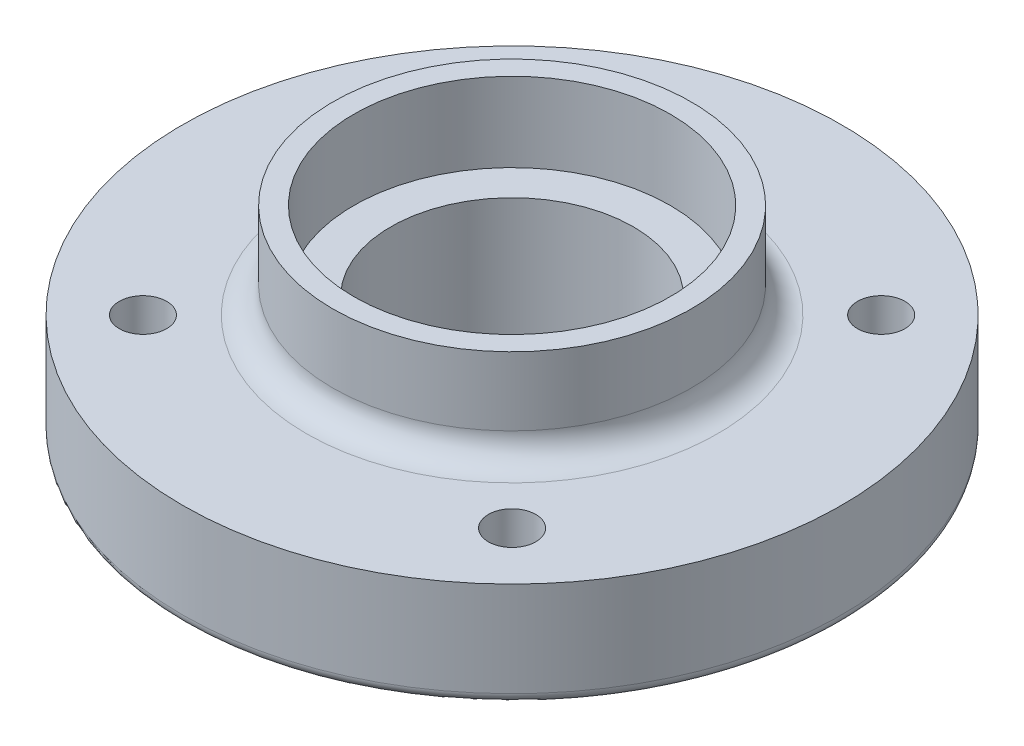
ISO-10303-21;
HEADER;
FILE_DESCRIPTION(('STEP AP214'),'2;1');
FILE_NAME('part.step','',(''),(''),'','','');
FILE_SCHEMA(('AUTOMOTIVE_DESIGN { 1 0 10303 214 1 1 1 1 }'));
ENDSEC;
DATA;
#1=APPLICATION_CONTEXT('core data for automotive mechanical design processes');
#2=APPLICATION_PROTOCOL_DEFINITION('international standard','automotive_design',2000,#1);
#3=PRODUCT_CONTEXT('',#1,'mechanical');
#4=PRODUCT('Part','Part','',(#3));
#5=PRODUCT_RELATED_PRODUCT_CATEGORY('part','',(#4));
#6=PRODUCT_DEFINITION_FORMATION('','',#4);
#7=PRODUCT_DEFINITION_CONTEXT('part definition',#1,'design');
#8=PRODUCT_DEFINITION('design','',#6,#7);
#9=PRODUCT_DEFINITION_SHAPE('','',#8);
#10=(LENGTH_UNIT() NAMED_UNIT(*) SI_UNIT(.MILLI.,.METRE.));
#11=(NAMED_UNIT(*) PLANE_ANGLE_UNIT() SI_UNIT($,.RADIAN.));
#12=(NAMED_UNIT(*) SI_UNIT($,.STERADIAN.) SOLID_ANGLE_UNIT());
#13=UNCERTAINTY_MEASURE_WITH_UNIT(LENGTH_MEASURE(1.E-05),#10,'distance_accuracy_value','');
#14=(GEOMETRIC_REPRESENTATION_CONTEXT(3) GLOBAL_UNCERTAINTY_ASSIGNED_CONTEXT((#13)) GLOBAL_UNIT_ASSIGNED_CONTEXT((#10,
#11,#12)) REPRESENTATION_CONTEXT('',''));
#15=CARTESIAN_POINT('',(0.,0.,0.));
#16=DIRECTION('',(0.,0.,1.));
#17=DIRECTION('',(1.,0.,0.));
#18=AXIS2_PLACEMENT_3D('',#15,#16,#17);
#19=CARTESIAN_POINT('',(0.,0.,0.));
#20=DIRECTION('',(0.,1.,0.));
#21=DIRECTION('',(0.,0.,1.));
#22=AXIS2_PLACEMENT_3D('',#19,#20,#21);
#23=PLANE('',#22);
#24=CARTESIAN_POINT('',(0.,0.,0.));
#25=DIRECTION('',(0.,1.,0.));
#26=DIRECTION('',(0.,0.,1.));
#27=AXIS2_PLACEMENT_3D('',#24,#25,#26);
#28=CIRCLE('',#27,36.);
#29=CARTESIAN_POINT('',(0.,0.,36.));
#30=VERTEX_POINT('',#29);
#31=EDGE_CURVE('E11',#30,#30,#28,.T.);
#32=ORIENTED_EDGE('',*,*,#31,.T.);
#33=EDGE_LOOP('',(#32));
#34=FACE_BOUND('',#33,.T.);
#35=CARTESIAN_POINT('',(-35.,0.,-35.));
#36=DIRECTION('',(0.,-1.,0.));
#37=DIRECTION('',(0.,0.,-1.));
#38=AXIS2_PLACEMENT_3D('',#35,#36,#37);
#39=CIRCLE('',#38,9.0055);
#40=CARTESIAN_POINT('',(-35.,0.,-44.0055));
#41=VERTEX_POINT('',#40);
#42=EDGE_CURVE('E79',#41,#41,#39,.T.);
#43=ORIENTED_EDGE('',*,*,#42,.F.);
#44=EDGE_LOOP('',(#43));
#45=FACE_BOUND('',#44,.T.);
#46=CARTESIAN_POINT('',(35.,0.,-35.));
#47=DIRECTION('',(0.,-1.,0.));
#48=DIRECTION('',(0.,0.,-1.));
#49=AXIS2_PLACEMENT_3D('',#46,#47,#48);
#50=CIRCLE('',#49,9.0055);
#51=CARTESIAN_POINT('',(35.,0.,-44.0055));
#52=VERTEX_POINT('',#51);
#53=EDGE_CURVE('E74',#52,#52,#50,.T.);
#54=ORIENTED_EDGE('',*,*,#53,.F.);
#55=EDGE_LOOP('',(#54));
#56=FACE_BOUND('',#55,.T.);
#57=CARTESIAN_POINT('',(35.,0.,35.));
#58=DIRECTION('',(0.,-1.,0.));
#59=DIRECTION('',(0.,0.,-1.));
#60=AXIS2_PLACEMENT_3D('',#57,#58,#59);
#61=CIRCLE('',#60,9.0055);
#62=CARTESIAN_POINT('',(35.,0.,25.9945));
#63=VERTEX_POINT('',#62);
#64=EDGE_CURVE('E69',#63,#63,#61,.T.);
#65=ORIENTED_EDGE('',*,*,#64,.F.);
#66=EDGE_LOOP('',(#65));
#67=FACE_BOUND('',#66,.T.);
#68=CARTESIAN_POINT('',(-35.,0.,35.));
#69=DIRECTION('',(0.,-1.,0.));
#70=DIRECTION('',(0.,0.,-1.));
#71=AXIS2_PLACEMENT_3D('',#68,#69,#70);
#72=CIRCLE('',#71,9.0055);
#73=CARTESIAN_POINT('',(-35.,0.,25.9945));
#74=VERTEX_POINT('',#73);
#75=EDGE_CURVE('E128',#74,#74,#72,.T.);
#76=ORIENTED_EDGE('',*,*,#75,.F.);
#77=EDGE_LOOP('',(#76));
#78=FACE_BOUND('',#77,.T.);
#79=CARTESIAN_POINT('',(0.,0.,0.));
#80=DIRECTION('',(0.,1.,0.));
#81=DIRECTION('',(0.,0.,1.));
#82=AXIS2_PLACEMENT_3D('',#79,#80,#81);
#83=CIRCLE('',#82,60.5);
#84=CARTESIAN_POINT('',(0.,0.,60.5));
#85=VERTEX_POINT('',#84);
#86=EDGE_CURVE('E59',#85,#85,#83,.F.);
#87=ORIENTED_EDGE('',*,*,#86,.T.);
#88=EDGE_LOOP('',(#87));
#89=FACE_BOUND('',#88,.T.);
#90=ADVANCED_FACE('F39',(#34,#45,#56,#67,#78,#89),#23,.F.);
#91=CARTESIAN_POINT('',(0.,20.,0.));
#92=DIRECTION('',(0.,-1.,0.));
#93=DIRECTION('',(0.,0.,-1.));
#94=AXIS2_PLACEMENT_3D('',#91,#92,#93);
#95=CYLINDRICAL_SURFACE('',#94,62.5);
#96=CARTESIAN_POINT('',(0.,2.,0.));
#97=DIRECTION('',(0.,1.,0.));
#98=DIRECTION('',(0.,0.,1.));
#99=AXIS2_PLACEMENT_3D('',#96,#97,#98);
#100=CIRCLE('',#99,62.5);
#101=CARTESIAN_POINT('',(0.,2.,62.5));
#102=VERTEX_POINT('',#101);
#103=EDGE_CURVE('E62',#102,#102,#100,.T.);
#104=ORIENTED_EDGE('',*,*,#103,.T.);
#105=EDGE_LOOP('',(#104));
#106=FACE_BOUND('',#105,.T.);
#107=CARTESIAN_POINT('',(0.,20.,0.));
#108=DIRECTION('',(0.,1.,0.));
#109=DIRECTION('',(0.,0.,1.));
#110=AXIS2_PLACEMENT_3D('',#107,#108,#109);
#111=CIRCLE('',#110,62.5);
#112=CARTESIAN_POINT('',(0.,20.,62.5));
#113=VERTEX_POINT('',#112);
#114=EDGE_CURVE('E91',#113,#113,#111,.T.);
#115=ORIENTED_EDGE('',*,*,#114,.F.);
#116=EDGE_LOOP('',(#115));
#117=FACE_BOUND('',#116,.T.);
#118=ADVANCED_FACE('F155',(#106,#117),#95,.T.);
#119=CARTESIAN_POINT('',(0.,20.,0.));
#120=DIRECTION('',(0.,1.,0.));
#121=DIRECTION('',(0.,0.,1.));
#122=AXIS2_PLACEMENT_3D('',#119,#120,#121);
#123=PLANE('',#122);
#124=CARTESIAN_POINT('',(-35.,20.,35.));
#125=DIRECTION('',(0.,1.,0.));
#126=DIRECTION('',(0.,0.,1.));
#127=AXIS2_PLACEMENT_3D('',#124,#125,#126);
#128=CIRCLE('',#127,4.5);
#129=CARTESIAN_POINT('',(-35.,20.,39.5));
#130=VERTEX_POINT('',#129);
#131=EDGE_CURVE('E66',#130,#130,#128,.T.);
#132=ORIENTED_EDGE('',*,*,#131,.F.);
#133=EDGE_LOOP('',(#132));
#134=FACE_BOUND('',#133,.T.);
#135=CARTESIAN_POINT('',(35.,20.,35.));
#136=DIRECTION('',(0.,1.,0.));
#137=DIRECTION('',(0.,0.,1.));
#138=AXIS2_PLACEMENT_3D('',#135,#136,#137);
#139=CIRCLE('',#138,4.5);
#140=CARTESIAN_POINT('',(35.,20.,39.5));
#141=VERTEX_POINT('',#140);
#142=EDGE_CURVE('E71',#141,#141,#139,.T.);
#143=ORIENTED_EDGE('',*,*,#142,.F.);
#144=EDGE_LOOP('',(#143));
#145=FACE_BOUND('',#144,.T.);
#146=CARTESIAN_POINT('',(35.,20.,-35.));
#147=DIRECTION('',(0.,1.,0.));
#148=DIRECTION('',(0.,0.,1.));
#149=AXIS2_PLACEMENT_3D('',#146,#147,#148);
#150=CIRCLE('',#149,4.5);
#151=CARTESIAN_POINT('',(35.,20.,-30.5));
#152=VERTEX_POINT('',#151);
#153=EDGE_CURVE('E76',#152,#152,#150,.T.);
#154=ORIENTED_EDGE('',*,*,#153,.F.);
#155=EDGE_LOOP('',(#154));
#156=FACE_BOUND('',#155,.T.);
#157=CARTESIAN_POINT('',(-35.,20.,-35.));
#158=DIRECTION('',(0.,1.,0.));
#159=DIRECTION('',(0.,0.,1.));
#160=AXIS2_PLACEMENT_3D('',#157,#158,#159);
#161=CIRCLE('',#160,4.5);
#162=CARTESIAN_POINT('',(-35.,20.,-30.5));
#163=VERTEX_POINT('',#162);
#164=EDGE_CURVE('E81',#163,#163,#161,.T.);
#165=ORIENTED_EDGE('',*,*,#164,.F.);
#166=EDGE_LOOP('',(#165));
#167=FACE_BOUND('',#166,.T.);
#168=CARTESIAN_POINT('',(0.,20.,0.));
#169=DIRECTION('',(0.,1.,0.));
#170=DIRECTION('',(0.,0.,1.));
#171=AXIS2_PLACEMENT_3D('',#168,#169,#170);
#172=CIRCLE('',#171,39.);
#173=CARTESIAN_POINT('',(0.,20.,39.));
#174=VERTEX_POINT('',#173);
#175=EDGE_CURVE('E65',#174,#174,#172,.F.);
#176=ORIENTED_EDGE('',*,*,#175,.T.);
#177=EDGE_LOOP('',(#176));
#178=FACE_BOUND('',#177,.T.);
#179=ORIENTED_EDGE('',*,*,#114,.T.);
#180=EDGE_LOOP('',(#179));
#181=FACE_BOUND('',#180,.T.);
#182=ADVANCED_FACE('F160',(#134,#145,#156,#167,#178,#181),#123,.T.);
#183=CARTESIAN_POINT('',(0.,38.,0.));
#184=DIRECTION('',(0.,-1.,0.));
#185=DIRECTION('',(0.,0.,-1.));
#186=AXIS2_PLACEMENT_3D('',#183,#184,#185);
#187=CYLINDRICAL_SURFACE('',#186,34.);
#188=CARTESIAN_POINT('',(0.,25.,0.));
#189=DIRECTION('',(0.,1.,0.));
#190=DIRECTION('',(0.,0.,1.));
#191=AXIS2_PLACEMENT_3D('',#188,#189,#190);
#192=CIRCLE('',#191,34.);
#193=CARTESIAN_POINT('',(0.,25.,34.));
#194=VERTEX_POINT('',#193);
#195=EDGE_CURVE('E88',#194,#194,#192,.T.);
#196=ORIENTED_EDGE('',*,*,#195,.T.);
#197=EDGE_LOOP('',(#196));
#198=FACE_BOUND('',#197,.T.);
#199=CARTESIAN_POINT('',(0.,38.,0.));
#200=DIRECTION('',(0.,1.,0.));
#201=DIRECTION('',(0.,0.,1.));
#202=AXIS2_PLACEMENT_3D('',#199,#200,#201);
#203=CIRCLE('',#202,34.);
#204=CARTESIAN_POINT('',(0.,38.,34.));
#205=VERTEX_POINT('',#204);
#206=EDGE_CURVE('E94',#205,#205,#203,.T.);
#207=ORIENTED_EDGE('',*,*,#206,.F.);
#208=EDGE_LOOP('',(#207));
#209=FACE_BOUND('',#208,.T.);
#210=ADVANCED_FACE('F366',(#198,#209),#187,.T.);
#211=CARTESIAN_POINT('',(0.,38.,0.));
#212=DIRECTION('',(0.,1.,0.));
#213=DIRECTION('',(0.,0.,1.));
#214=AXIS2_PLACEMENT_3D('',#211,#212,#213);
#215=PLANE('',#214);
#216=CARTESIAN_POINT('',(0.,38.,0.));
#217=DIRECTION('',(0.,1.,0.));
#218=DIRECTION('',(0.,0.,1.));
#219=AXIS2_PLACEMENT_3D('',#216,#217,#218);
#220=CIRCLE('',#219,30.);
#221=CARTESIAN_POINT('',(0.,38.,30.));
#222=VERTEX_POINT('',#221);
#223=EDGE_CURVE('E84',#222,#222,#220,.T.);
#224=ORIENTED_EDGE('',*,*,#223,.F.);
#225=EDGE_LOOP('',(#224));
#226=FACE_BOUND('',#225,.T.);
#227=ORIENTED_EDGE('',*,*,#206,.T.);
#228=EDGE_LOOP('',(#227));
#229=FACE_BOUND('',#228,.T.);
#230=ADVANCED_FACE('F380',(#226,#229),#215,.T.);
#231=CARTESIAN_POINT('',(0.,23.,0.));
#232=DIRECTION('',(0.,1.,0.));
#233=DIRECTION('',(0.,0.,1.));
#234=AXIS2_PLACEMENT_3D('',#231,#232,#233);
#235=CYLINDRICAL_SURFACE('',#234,30.);
#236=CARTESIAN_POINT('',(0.,23.,0.));
#237=DIRECTION('',(0.,1.,0.));
#238=DIRECTION('',(0.,0.,1.));
#239=AXIS2_PLACEMENT_3D('',#236,#237,#238);
#240=CIRCLE('',#239,30.);
#241=CARTESIAN_POINT('',(0.,23.,30.));
#242=VERTEX_POINT('',#241);
#243=EDGE_CURVE('E97',#242,#242,#240,.T.);
#244=ORIENTED_EDGE('',*,*,#243,.F.);
#245=EDGE_LOOP('',(#244));
#246=FACE_BOUND('',#245,.T.);
#247=ORIENTED_EDGE('',*,*,#223,.T.);
#248=EDGE_LOOP('',(#247));
#249=FACE_BOUND('',#248,.T.);
#250=ADVANCED_FACE('F223',(#246,#249),#235,.F.);
#251=CARTESIAN_POINT('',(0.,23.,0.));
#252=DIRECTION('',(0.,1.,0.));
#253=DIRECTION('',(0.,0.,1.));
#254=AXIS2_PLACEMENT_3D('',#251,#252,#253);
#255=PLANE('',#254);
#256=CARTESIAN_POINT('',(0.,23.,0.));
#257=DIRECTION('',(0.,1.,0.));
#258=DIRECTION('',(0.,0.,1.));
#259=AXIS2_PLACEMENT_3D('',#256,#257,#258);
#260=CIRCLE('',#259,23.);
#261=CARTESIAN_POINT('',(0.,23.,23.));
#262=VERTEX_POINT('',#261);
#263=EDGE_CURVE('E131',#262,#262,#260,.T.);
#264=ORIENTED_EDGE('',*,*,#263,.F.);
#265=EDGE_LOOP('',(#264));
#266=FACE_BOUND('',#265,.T.);
#267=ORIENTED_EDGE('',*,*,#243,.T.);
#268=EDGE_LOOP('',(#267));
#269=FACE_BOUND('',#268,.T.);
#270=ADVANCED_FACE('F171',(#266,#269),#255,.T.);
#271=CARTESIAN_POINT('',(0.,25.,0.));
#272=DIRECTION('',(0.,1.,0.));
#273=DIRECTION('',(0.,0.,1.));
#274=AXIS2_PLACEMENT_3D('',#271,#272,#273);
#275=TOROIDAL_SURFACE('',#274,39.,5.);
#276=ORIENTED_EDGE('',*,*,#175,.F.);
#277=EDGE_LOOP('',(#276));
#278=FACE_BOUND('',#277,.T.);
#279=ORIENTED_EDGE('',*,*,#195,.F.);
#280=EDGE_LOOP('',(#279));
#281=FACE_BOUND('',#280,.T.);
#282=ADVANCED_FACE('F167',(#278,#281),#275,.F.);
#283=CARTESIAN_POINT('',(-35.,0.,-35.));
#284=DIRECTION('',(0.,-1.,0.));
#285=DIRECTION('',(0.,0.,-1.));
#286=AXIS2_PLACEMENT_3D('',#283,#284,#285);
#287=CYLINDRICAL_SURFACE('',#286,4.5);
#288=ORIENTED_EDGE('',*,*,#164,.T.);
#289=EDGE_LOOP('',(#288));
#290=FACE_BOUND('',#289,.T.);
#291=CARTESIAN_POINT('',(-35.,5.3,-35.));
#292=DIRECTION('',(0.,-1.,0.));
#293=DIRECTION('',(0.,0.,-1.));
#294=AXIS2_PLACEMENT_3D('',#291,#292,#293);
#295=CIRCLE('',#294,4.50000000000001);
#296=CARTESIAN_POINT('',(-35.,5.3,-39.5));
#297=VERTEX_POINT('',#296);
#298=EDGE_CURVE('E85',#297,#297,#295,.T.);
#299=ORIENTED_EDGE('',*,*,#298,.T.);
#300=EDGE_LOOP('',(#299));
#301=FACE_BOUND('',#300,.T.);
#302=ADVANCED_FACE('F170',(#290,#301),#287,.F.);
#303=CARTESIAN_POINT('',(-30.5,5.3,-35.));
#304=DIRECTION('',(0.,1.,0.));
#305=DIRECTION('',(0.,0.,1.));
#306=AXIS2_PLACEMENT_3D('',#303,#304,#305);
#307=PLANE('',#306);
#308=ORIENTED_EDGE('',*,*,#298,.F.);
#309=EDGE_LOOP('',(#308));
#310=FACE_BOUND('',#309,.T.);
#311=CARTESIAN_POINT('',(-35.,5.3,-35.));
#312=DIRECTION('',(0.,-1.,0.));
#313=DIRECTION('',(0.,0.,-1.));
#314=AXIS2_PLACEMENT_3D('',#311,#312,#313);
#315=CIRCLE('',#314,9.0055);
#316=CARTESIAN_POINT('',(-35.,5.3,-44.0055));
#317=VERTEX_POINT('',#316);
#318=EDGE_CURVE('E104',#317,#317,#315,.T.);
#319=ORIENTED_EDGE('',*,*,#318,.T.);
#320=EDGE_LOOP('',(#319));
#321=FACE_BOUND('',#320,.T.);
#322=ADVANCED_FACE('F340',(#310,#321),#307,.F.);
#323=CARTESIAN_POINT('',(-35.,0.,-35.));
#324=DIRECTION('',(0.,-1.,0.));
#325=DIRECTION('',(0.,0.,-1.));
#326=AXIS2_PLACEMENT_3D('',#323,#324,#325);
#327=CYLINDRICAL_SURFACE('',#326,9.0055);
#328=ORIENTED_EDGE('',*,*,#318,.F.);
#329=EDGE_LOOP('',(#328));
#330=FACE_BOUND('',#329,.T.);
#331=ORIENTED_EDGE('',*,*,#42,.T.);
#332=EDGE_LOOP('',(#331));
#333=FACE_BOUND('',#332,.T.);
#334=ADVANCED_FACE('F330',(#330,#333),#327,.F.);
#335=CARTESIAN_POINT('',(35.,0.,-35.));
#336=DIRECTION('',(0.,-1.,0.));
#337=DIRECTION('',(0.,0.,-1.));
#338=AXIS2_PLACEMENT_3D('',#335,#336,#337);
#339=CYLINDRICAL_SURFACE('',#338,4.5);
#340=ORIENTED_EDGE('',*,*,#153,.T.);
#341=EDGE_LOOP('',(#340));
#342=FACE_BOUND('',#341,.T.);
#343=CARTESIAN_POINT('',(35.,5.3,-35.));
#344=DIRECTION('',(0.,-1.,0.));
#345=DIRECTION('',(0.,0.,-1.));
#346=AXIS2_PLACEMENT_3D('',#343,#344,#345);
#347=CIRCLE('',#346,4.50000000000001);
#348=CARTESIAN_POINT('',(35.,5.3,-39.5));
#349=VERTEX_POINT('',#348);
#350=EDGE_CURVE('E80',#349,#349,#347,.T.);
#351=ORIENTED_EDGE('',*,*,#350,.T.);
#352=EDGE_LOOP('',(#351));
#353=FACE_BOUND('',#352,.T.);
#354=ADVANCED_FACE('F320',(#342,#353),#339,.F.);
#355=CARTESIAN_POINT('',(39.5,5.3,-35.));
#356=DIRECTION('',(0.,1.,0.));
#357=DIRECTION('',(0.,0.,1.));
#358=AXIS2_PLACEMENT_3D('',#355,#356,#357);
#359=PLANE('',#358);
#360=ORIENTED_EDGE('',*,*,#350,.F.);
#361=EDGE_LOOP('',(#360));
#362=FACE_BOUND('',#361,.T.);
#363=CARTESIAN_POINT('',(35.,5.3,-35.));
#364=DIRECTION('',(0.,-1.,0.));
#365=DIRECTION('',(0.,0.,-1.));
#366=AXIS2_PLACEMENT_3D('',#363,#364,#365);
#367=CIRCLE('',#366,9.0055);
#368=CARTESIAN_POINT('',(35.,5.3,-44.0055));
#369=VERTEX_POINT('',#368);
#370=EDGE_CURVE('E111',#369,#369,#367,.T.);
#371=ORIENTED_EDGE('',*,*,#370,.T.);
#372=EDGE_LOOP('',(#371));
#373=FACE_BOUND('',#372,.T.);
#374=ADVANCED_FACE('F310',(#362,#373),#359,.F.);
#375=CARTESIAN_POINT('',(35.,0.,-35.));
#376=DIRECTION('',(0.,-1.,0.));
#377=DIRECTION('',(0.,0.,-1.));
#378=AXIS2_PLACEMENT_3D('',#375,#376,#377);
#379=CYLINDRICAL_SURFACE('',#378,9.0055);
#380=ORIENTED_EDGE('',*,*,#370,.F.);
#381=EDGE_LOOP('',(#380));
#382=FACE_BOUND('',#381,.T.);
#383=ORIENTED_EDGE('',*,*,#53,.T.);
#384=EDGE_LOOP('',(#383));
#385=FACE_BOUND('',#384,.T.);
#386=ADVANCED_FACE('F300',(#382,#385),#379,.F.);
#387=CARTESIAN_POINT('',(35.,0.,35.));
#388=DIRECTION('',(0.,-1.,0.));
#389=DIRECTION('',(0.,0.,-1.));
#390=AXIS2_PLACEMENT_3D('',#387,#388,#389);
#391=CYLINDRICAL_SURFACE('',#390,4.5);
#392=ORIENTED_EDGE('',*,*,#142,.T.);
#393=EDGE_LOOP('',(#392));
#394=FACE_BOUND('',#393,.T.);
#395=CARTESIAN_POINT('',(35.,5.3,35.));
#396=DIRECTION('',(0.,-1.,0.));
#397=DIRECTION('',(0.,0.,-1.));
#398=AXIS2_PLACEMENT_3D('',#395,#396,#397);
#399=CIRCLE('',#398,4.50000000000001);
#400=CARTESIAN_POINT('',(35.,5.3,30.5));
#401=VERTEX_POINT('',#400);
#402=EDGE_CURVE('E75',#401,#401,#399,.T.);
#403=ORIENTED_EDGE('',*,*,#402,.T.);
#404=EDGE_LOOP('',(#403));
#405=FACE_BOUND('',#404,.T.);
#406=ADVANCED_FACE('F290',(#394,#405),#391,.F.);
#407=CARTESIAN_POINT('',(39.5,5.3,35.));
#408=DIRECTION('',(0.,1.,0.));
#409=DIRECTION('',(0.,0.,1.));
#410=AXIS2_PLACEMENT_3D('',#407,#408,#409);
#411=PLANE('',#410);
#412=ORIENTED_EDGE('',*,*,#402,.F.);
#413=EDGE_LOOP('',(#412));
#414=FACE_BOUND('',#413,.T.);
#415=CARTESIAN_POINT('',(35.,5.3,35.));
#416=DIRECTION('',(0.,-1.,0.));
#417=DIRECTION('',(0.,0.,-1.));
#418=AXIS2_PLACEMENT_3D('',#415,#416,#417);
#419=CIRCLE('',#418,9.0055);
#420=CARTESIAN_POINT('',(35.,5.3,25.9945));
#421=VERTEX_POINT('',#420);
#422=EDGE_CURVE('E118',#421,#421,#419,.T.);
#423=ORIENTED_EDGE('',*,*,#422,.T.);
#424=EDGE_LOOP('',(#423));
#425=FACE_BOUND('',#424,.T.);
#426=ADVANCED_FACE('F280',(#414,#425),#411,.F.);
#427=CARTESIAN_POINT('',(35.,0.,35.));
#428=DIRECTION('',(0.,-1.,0.));
#429=DIRECTION('',(0.,0.,-1.));
#430=AXIS2_PLACEMENT_3D('',#427,#428,#429);
#431=CYLINDRICAL_SURFACE('',#430,9.0055);
#432=ORIENTED_EDGE('',*,*,#422,.F.);
#433=EDGE_LOOP('',(#432));
#434=FACE_BOUND('',#433,.T.);
#435=ORIENTED_EDGE('',*,*,#64,.T.);
#436=EDGE_LOOP('',(#435));
#437=FACE_BOUND('',#436,.T.);
#438=ADVANCED_FACE('F270',(#434,#437),#431,.F.);
#439=CARTESIAN_POINT('',(-35.,0.,35.));
#440=DIRECTION('',(0.,-1.,0.));
#441=DIRECTION('',(0.,0.,-1.));
#442=AXIS2_PLACEMENT_3D('',#439,#440,#441);
#443=CYLINDRICAL_SURFACE('',#442,4.5);
#444=ORIENTED_EDGE('',*,*,#131,.T.);
#445=EDGE_LOOP('',(#444));
#446=FACE_BOUND('',#445,.T.);
#447=CARTESIAN_POINT('',(-35.,5.3,35.));
#448=DIRECTION('',(0.,-1.,0.));
#449=DIRECTION('',(0.,0.,-1.));
#450=AXIS2_PLACEMENT_3D('',#447,#448,#449);
#451=CIRCLE('',#450,4.50000000000001);
#452=CARTESIAN_POINT('',(-35.,5.3,30.5));
#453=VERTEX_POINT('',#452);
#454=EDGE_CURVE('E70',#453,#453,#451,.T.);
#455=ORIENTED_EDGE('',*,*,#454,.T.);
#456=EDGE_LOOP('',(#455));
#457=FACE_BOUND('',#456,.T.);
#458=ADVANCED_FACE('F260',(#446,#457),#443,.F.);
#459=CARTESIAN_POINT('',(-30.5,5.3,35.));
#460=DIRECTION('',(0.,1.,0.));
#461=DIRECTION('',(0.,0.,1.));
#462=AXIS2_PLACEMENT_3D('',#459,#460,#461);
#463=PLANE('',#462);
#464=ORIENTED_EDGE('',*,*,#454,.F.);
#465=EDGE_LOOP('',(#464));
#466=FACE_BOUND('',#465,.T.);
#467=CARTESIAN_POINT('',(-35.,5.3,35.));
#468=DIRECTION('',(0.,-1.,0.));
#469=DIRECTION('',(0.,0.,-1.));
#470=AXIS2_PLACEMENT_3D('',#467,#468,#469);
#471=CIRCLE('',#470,9.0055);
#472=CARTESIAN_POINT('',(-35.,5.3,25.9945));
#473=VERTEX_POINT('',#472);
#474=EDGE_CURVE('E125',#473,#473,#471,.T.);
#475=ORIENTED_EDGE('',*,*,#474,.T.);
#476=EDGE_LOOP('',(#475));
#477=FACE_BOUND('',#476,.T.);
#478=ADVANCED_FACE('F250',(#466,#477),#463,.F.);
#479=CARTESIAN_POINT('',(-35.,0.,35.));
#480=DIRECTION('',(0.,-1.,0.));
#481=DIRECTION('',(0.,0.,-1.));
#482=AXIS2_PLACEMENT_3D('',#479,#480,#481);
#483=CYLINDRICAL_SURFACE('',#482,9.0055);
#484=ORIENTED_EDGE('',*,*,#474,.F.);
#485=EDGE_LOOP('',(#484));
#486=FACE_BOUND('',#485,.T.);
#487=ORIENTED_EDGE('',*,*,#75,.T.);
#488=EDGE_LOOP('',(#487));
#489=FACE_BOUND('',#488,.T.);
#490=ADVANCED_FACE('F174',(#486,#489),#483,.F.);
#491=CARTESIAN_POINT('',(0.,2.,0.));
#492=DIRECTION('',(0.,1.,0.));
#493=DIRECTION('',(0.,0.,1.));
#494=AXIS2_PLACEMENT_3D('',#491,#492,#493);
#495=TOROIDAL_SURFACE('',#494,60.5,2.);
#496=ORIENTED_EDGE('',*,*,#86,.F.);
#497=EDGE_LOOP('',(#496));
#498=FACE_BOUND('',#497,.T.);
#499=ORIENTED_EDGE('',*,*,#103,.F.);
#500=EDGE_LOOP('',(#499));
#501=FACE_BOUND('',#500,.T.);
#502=ADVANCED_FACE('F151',(#498,#501),#495,.T.);
#503=CARTESIAN_POINT('',(0.,-30.,0.));
#504=DIRECTION('',(0.,1.,0.));
#505=DIRECTION('',(0.,0.,1.));
#506=AXIS2_PLACEMENT_3D('',#503,#504,#505);
#507=CYLINDRICAL_SURFACE('',#506,23.);
#508=ORIENTED_EDGE('',*,*,#263,.T.);
#509=EDGE_LOOP('',(#508));
#510=FACE_BOUND('',#509,.T.);
#511=CARTESIAN_POINT('',(0.,-15.,0.));
#512=DIRECTION('',(0.,-1.,0.));
#513=DIRECTION('',(0.,0.,-1.));
#514=AXIS2_PLACEMENT_3D('',#511,#512,#513);
#515=CIRCLE('',#514,23.);
#516=CARTESIAN_POINT('',(0.,-15.,-23.));
#517=VERTEX_POINT('',#516);
#518=EDGE_CURVE('E134',#517,#517,#515,.T.);
#519=ORIENTED_EDGE('',*,*,#518,.T.);
#520=EDGE_LOOP('',(#519));
#521=FACE_BOUND('',#520,.T.);
#522=ADVANCED_FACE('F138',(#510,#521),#507,.F.);
#523=CARTESIAN_POINT('',(0.,-15.,0.));
#524=DIRECTION('',(0.,-1.,0.));
#525=DIRECTION('',(0.,0.,-1.));
#526=AXIS2_PLACEMENT_3D('',#523,#524,#525);
#527=PLANE('',#526);
#528=CARTESIAN_POINT('',(0.,-15.,0.));
#529=DIRECTION('',(0.,-1.,0.));
#530=DIRECTION('',(0.,0.,-1.));
#531=AXIS2_PLACEMENT_3D('',#528,#529,#530);
#532=CIRCLE('',#531,34.);
#533=CARTESIAN_POINT('',(0.,-15.,-34.));
#534=VERTEX_POINT('',#533);
#535=EDGE_CURVE('E54',#534,#534,#532,.T.);
#536=ORIENTED_EDGE('',*,*,#535,.T.);
#537=EDGE_LOOP('',(#536));
#538=FACE_BOUND('',#537,.T.);
#539=ORIENTED_EDGE('',*,*,#518,.F.);
#540=EDGE_LOOP('',(#539));
#541=FACE_BOUND('',#540,.T.);
#542=ADVANCED_FACE('F140',(#538,#541),#527,.T.);
#543=CARTESIAN_POINT('',(0.,-15.,0.));
#544=DIRECTION('',(0.,1.,0.));
#545=DIRECTION('',(0.,0.,1.));
#546=AXIS2_PLACEMENT_3D('',#543,#544,#545);
#547=CYLINDRICAL_SURFACE('',#546,35.);
#548=CARTESIAN_POINT('',(0.,-14.,0.));
#549=DIRECTION('',(0.,-1.,0.));
#550=DIRECTION('',(0.,0.,-1.));
#551=AXIS2_PLACEMENT_3D('',#548,#549,#550);
#552=CIRCLE('',#551,35.);
#553=CARTESIAN_POINT('',(0.,-14.,-35.));
#554=VERTEX_POINT('',#553);
#555=EDGE_CURVE('E46',#554,#554,#552,.F.);
#556=ORIENTED_EDGE('',*,*,#555,.T.);
#557=EDGE_LOOP('',(#556));
#558=FACE_BOUND('',#557,.T.);
#559=CARTESIAN_POINT('',(0.,-1.,0.));
#560=DIRECTION('',(0.,1.,0.));
#561=DIRECTION('',(0.,0.,1.));
#562=AXIS2_PLACEMENT_3D('',#559,#560,#561);
#563=CIRCLE('',#562,35.);
#564=CARTESIAN_POINT('',(0.,-1.,35.));
#565=VERTEX_POINT('',#564);
#566=EDGE_CURVE('E50',#565,#565,#563,.F.);
#567=ORIENTED_EDGE('',*,*,#566,.T.);
#568=EDGE_LOOP('',(#567));
#569=FACE_BOUND('',#568,.T.);
#570=ADVANCED_FACE('F142',(#558,#569),#547,.T.);
#571=CARTESIAN_POINT('',(0.,-14.,0.));
#572=DIRECTION('',(0.,-1.,0.));
#573=DIRECTION('',(0.,0.,-1.));
#574=AXIS2_PLACEMENT_3D('',#571,#572,#573);
#575=TOROIDAL_SURFACE('',#574,34.,1.);
#576=ORIENTED_EDGE('',*,*,#555,.F.);
#577=EDGE_LOOP('',(#576));
#578=FACE_BOUND('',#577,.T.);
#579=ORIENTED_EDGE('',*,*,#535,.F.);
#580=EDGE_LOOP('',(#579));
#581=FACE_BOUND('',#580,.T.);
#582=ADVANCED_FACE('F149',(#578,#581),#575,.T.);
#583=CARTESIAN_POINT('',(0.,-1.,0.));
#584=DIRECTION('',(0.,1.,0.));
#585=DIRECTION('',(0.,0.,1.));
#586=AXIS2_PLACEMENT_3D('',#583,#584,#585);
#587=TOROIDAL_SURFACE('',#586,36.,1.);
#588=ORIENTED_EDGE('',*,*,#31,.F.);
#589=EDGE_LOOP('',(#588));
#590=FACE_BOUND('',#589,.T.);
#591=ORIENTED_EDGE('',*,*,#566,.F.);
#592=EDGE_LOOP('',(#591));
#593=FACE_BOUND('',#592,.T.);
#594=ADVANCED_FACE('F41',(#590,#593),#587,.F.);
#595=CLOSED_SHELL('',(#90,#118,#182,#210,#230,#250,#270,#282,#302,#322,#334,#354,#374,#386,#406,
#426,#438,#458,#478,#490,#502,#522,#542,#570,#582,#594));
#596=MANIFOLD_SOLID_BREP('B2',#595);
#597=ADVANCED_BREP_SHAPE_REPRESENTATION('',(#18,#596),#14);
#598=SHAPE_DEFINITION_REPRESENTATION(#9,#597);
ENDSEC;
END-ISO-10303-21;
